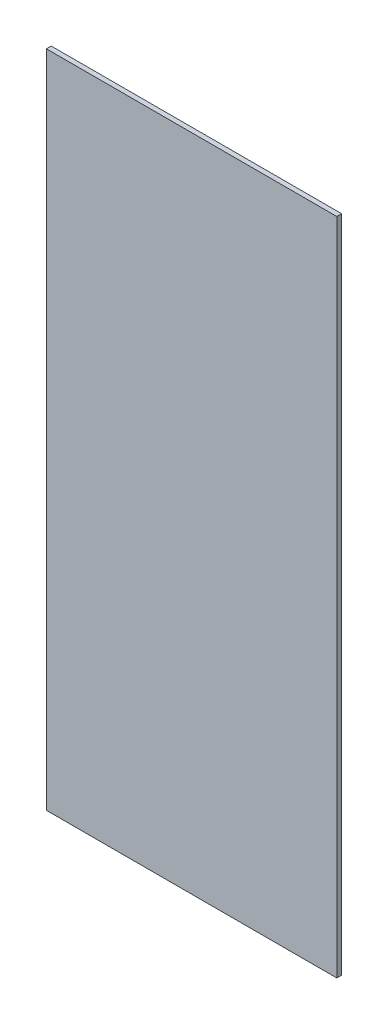
ISO-10303-21;
HEADER;
FILE_DESCRIPTION(('STEP AP214'),'2;1');
FILE_NAME('part.step','',(''),(''),'','','');
FILE_SCHEMA(('AUTOMOTIVE_DESIGN { 1 0 10303 214 1 1 1 1 }'));
ENDSEC;
DATA;
#1=APPLICATION_CONTEXT('core data for automotive mechanical design processes');
#2=APPLICATION_PROTOCOL_DEFINITION('international standard','automotive_design',2000,#1);
#3=PRODUCT_CONTEXT('',#1,'mechanical');
#4=PRODUCT('Part','Part','',(#3));
#5=PRODUCT_RELATED_PRODUCT_CATEGORY('part','',(#4));
#6=PRODUCT_DEFINITION_FORMATION('','',#4);
#7=PRODUCT_DEFINITION_CONTEXT('part definition',#1,'design');
#8=PRODUCT_DEFINITION('design','',#6,#7);
#9=PRODUCT_DEFINITION_SHAPE('','',#8);
#10=(LENGTH_UNIT() NAMED_UNIT(*) SI_UNIT(.MILLI.,.METRE.));
#11=(NAMED_UNIT(*) PLANE_ANGLE_UNIT() SI_UNIT($,.RADIAN.));
#12=(NAMED_UNIT(*) SI_UNIT($,.STERADIAN.) SOLID_ANGLE_UNIT());
#13=UNCERTAINTY_MEASURE_WITH_UNIT(LENGTH_MEASURE(1.E-05),#10,'distance_accuracy_value','');
#14=(GEOMETRIC_REPRESENTATION_CONTEXT(3) GLOBAL_UNCERTAINTY_ASSIGNED_CONTEXT((#13)) GLOBAL_UNIT_ASSIGNED_CONTEXT((#10,
#11,#12)) REPRESENTATION_CONTEXT('',''));
#15=CARTESIAN_POINT('',(0.,0.,0.));
#16=DIRECTION('',(0.,0.,1.));
#17=DIRECTION('',(1.,0.,0.));
#18=AXIS2_PLACEMENT_3D('',#15,#16,#17);
#19=CARTESIAN_POINT('',(-178.,408.,3.));
#20=DIRECTION('',(1.,0.,0.));
#21=DIRECTION('',(0.,0.,-1.));
#22=AXIS2_PLACEMENT_3D('',#19,#20,#21);
#23=PLANE('',#22);
#24=DIRECTION('',(0.,-1.,0.));
#25=VECTOR('',#24,1.);
#26=CARTESIAN_POINT('',(-178.,408.,0.));
#27=LINE('',#26,#25);
#28=CARTESIAN_POINT('',(-178.,408.,0.));
#29=VERTEX_POINT('',#28);
#30=CARTESIAN_POINT('',(-178.,-2.99999999999999,0.));
#31=VERTEX_POINT('',#30);
#32=EDGE_CURVE('E96',#29,#31,#27,.T.);
#33=ORIENTED_EDGE('',*,*,#32,.T.);
#34=DIRECTION('',(0.,0.,-1.));
#35=VECTOR('',#34,1.);
#36=CARTESIAN_POINT('',(-178.,-2.99999999999999,3.));
#37=LINE('',#36,#35);
#38=CARTESIAN_POINT('',(-178.,-2.99999999999999,3.));
#39=VERTEX_POINT('',#38);
#40=EDGE_CURVE('E11',#39,#31,#37,.T.);
#41=ORIENTED_EDGE('',*,*,#40,.F.);
#42=DIRECTION('',(0.,-1.,0.));
#43=VECTOR('',#42,1.);
#44=CARTESIAN_POINT('',(-178.,408.,3.));
#45=LINE('',#44,#43);
#46=CARTESIAN_POINT('',(-178.,408.,3.));
#47=VERTEX_POINT('',#46);
#48=EDGE_CURVE('E84',#47,#39,#45,.T.);
#49=ORIENTED_EDGE('',*,*,#48,.F.);
#50=DIRECTION('',(0.,0.,-1.));
#51=VECTOR('',#50,1.);
#52=CARTESIAN_POINT('',(-178.,408.,3.));
#53=LINE('',#52,#51);
#54=EDGE_CURVE('E92',#47,#29,#53,.T.);
#55=ORIENTED_EDGE('',*,*,#54,.T.);
#56=EDGE_LOOP('',(#33,#41,#49,#55));
#57=FACE_BOUND('',#56,.T.);
#58=ADVANCED_FACE('F33',(#57),#23,.F.);
#59=CARTESIAN_POINT('',(-178.,-2.99999999999999,3.));
#60=DIRECTION('',(0.,1.,0.));
#61=DIRECTION('',(0.,0.,1.));
#62=AXIS2_PLACEMENT_3D('',#59,#60,#61);
#63=PLANE('',#62);
#64=DIRECTION('',(1.,0.,0.));
#65=VECTOR('',#64,1.);
#66=CARTESIAN_POINT('',(-178.,-2.99999999999999,0.));
#67=LINE('',#66,#65);
#68=CARTESIAN_POINT('',(3.,-2.99999999999999,0.));
#69=VERTEX_POINT('',#68);
#70=EDGE_CURVE('E88',#31,#69,#67,.T.);
#71=ORIENTED_EDGE('',*,*,#70,.T.);
#72=DIRECTION('',(0.,0.,-1.));
#73=VECTOR('',#72,1.);
#74=CARTESIAN_POINT('',(3.,-2.99999999999999,3.));
#75=LINE('',#74,#73);
#76=CARTESIAN_POINT('',(3.,-2.99999999999999,3.));
#77=VERTEX_POINT('',#76);
#78=EDGE_CURVE('E41',#77,#69,#75,.T.);
#79=ORIENTED_EDGE('',*,*,#78,.F.);
#80=DIRECTION('',(1.,0.,0.));
#81=VECTOR('',#80,1.);
#82=CARTESIAN_POINT('',(-178.,-2.99999999999999,3.));
#83=LINE('',#82,#81);
#84=EDGE_CURVE('E79',#39,#77,#83,.T.);
#85=ORIENTED_EDGE('',*,*,#84,.F.);
#86=ORIENTED_EDGE('',*,*,#40,.T.);
#87=EDGE_LOOP('',(#71,#79,#85,#86));
#88=FACE_BOUND('',#87,.T.);
#89=ADVANCED_FACE('F87',(#88),#63,.F.);
#90=CARTESIAN_POINT('',(3.,-2.99999999999999,3.));
#91=DIRECTION('',(-1.,0.,0.));
#92=DIRECTION('',(0.,0.,1.));
#93=AXIS2_PLACEMENT_3D('',#90,#91,#92);
#94=PLANE('',#93);
#95=DIRECTION('',(0.,1.,0.));
#96=VECTOR('',#95,1.);
#97=CARTESIAN_POINT('',(3.,-2.99999999999999,0.));
#98=LINE('',#97,#96);
#99=CARTESIAN_POINT('',(3.,408.,0.));
#100=VERTEX_POINT('',#99);
#101=EDGE_CURVE('E66',#69,#100,#98,.T.);
#102=ORIENTED_EDGE('',*,*,#101,.T.);
#103=DIRECTION('',(0.,0.,-1.));
#104=VECTOR('',#103,1.);
#105=CARTESIAN_POINT('',(3.,408.,3.));
#106=LINE('',#105,#104);
#107=CARTESIAN_POINT('',(3.,408.,3.));
#108=VERTEX_POINT('',#107);
#109=EDGE_CURVE('E89',#108,#100,#106,.T.);
#110=ORIENTED_EDGE('',*,*,#109,.F.);
#111=DIRECTION('',(0.,1.,0.));
#112=VECTOR('',#111,1.);
#113=CARTESIAN_POINT('',(3.,-2.99999999999999,3.));
#114=LINE('',#113,#112);
#115=EDGE_CURVE('E82',#77,#108,#114,.T.);
#116=ORIENTED_EDGE('',*,*,#115,.F.);
#117=ORIENTED_EDGE('',*,*,#78,.T.);
#118=EDGE_LOOP('',(#102,#110,#116,#117));
#119=FACE_BOUND('',#118,.T.);
#120=ADVANCED_FACE('F90',(#119),#94,.F.);
#121=CARTESIAN_POINT('',(3.,408.,3.));
#122=DIRECTION('',(0.,-1.,0.));
#123=DIRECTION('',(0.,0.,-1.));
#124=AXIS2_PLACEMENT_3D('',#121,#122,#123);
#125=PLANE('',#124);
#126=DIRECTION('',(-1.,0.,0.));
#127=VECTOR('',#126,1.);
#128=CARTESIAN_POINT('',(3.,408.,0.));
#129=LINE('',#128,#127);
#130=EDGE_CURVE('E72',#100,#29,#129,.T.);
#131=ORIENTED_EDGE('',*,*,#130,.T.);
#132=ORIENTED_EDGE('',*,*,#54,.F.);
#133=DIRECTION('',(-1.,0.,0.));
#134=VECTOR('',#133,1.);
#135=CARTESIAN_POINT('',(3.,408.,3.));
#136=LINE('',#135,#134);
#137=EDGE_CURVE('E49',#108,#47,#136,.T.);
#138=ORIENTED_EDGE('',*,*,#137,.F.);
#139=ORIENTED_EDGE('',*,*,#109,.T.);
#140=EDGE_LOOP('',(#131,#132,#138,#139));
#141=FACE_BOUND('',#140,.T.);
#142=ADVANCED_FACE('F103',(#141),#125,.F.);
#143=CARTESIAN_POINT('',(0.,0.,3.));
#144=DIRECTION('',(0.,0.,1.));
#145=DIRECTION('',(1.,0.,0.));
#146=AXIS2_PLACEMENT_3D('',#143,#144,#145);
#147=PLANE('',#146);
#148=ORIENTED_EDGE('',*,*,#48,.T.);
#149=ORIENTED_EDGE('',*,*,#84,.T.);
#150=ORIENTED_EDGE('',*,*,#115,.T.);
#151=ORIENTED_EDGE('',*,*,#137,.T.);
#152=EDGE_LOOP('',(#148,#149,#150,#151));
#153=FACE_BOUND('',#152,.T.);
#154=ADVANCED_FACE('F80',(#153),#147,.T.);
#155=CARTESIAN_POINT('',(0.,0.,0.));
#156=DIRECTION('',(0.,0.,1.));
#157=DIRECTION('',(1.,0.,0.));
#158=AXIS2_PLACEMENT_3D('',#155,#156,#157);
#159=PLANE('',#158);
#160=ORIENTED_EDGE('',*,*,#32,.F.);
#161=ORIENTED_EDGE('',*,*,#130,.F.);
#162=ORIENTED_EDGE('',*,*,#101,.F.);
#163=ORIENTED_EDGE('',*,*,#70,.F.);
#164=EDGE_LOOP('',(#160,#161,#162,#163));
#165=FACE_BOUND('',#164,.T.);
#166=ADVANCED_FACE('F106',(#165),#159,.F.);
#167=CLOSED_SHELL('',(#58,#89,#120,#142,#154,#166));
#168=MANIFOLD_SOLID_BREP('B2',#167);
#169=ADVANCED_BREP_SHAPE_REPRESENTATION('',(#18,#168),#14);
#170=SHAPE_DEFINITION_REPRESENTATION(#9,#169);
ENDSEC;
END-ISO-10303-21;
